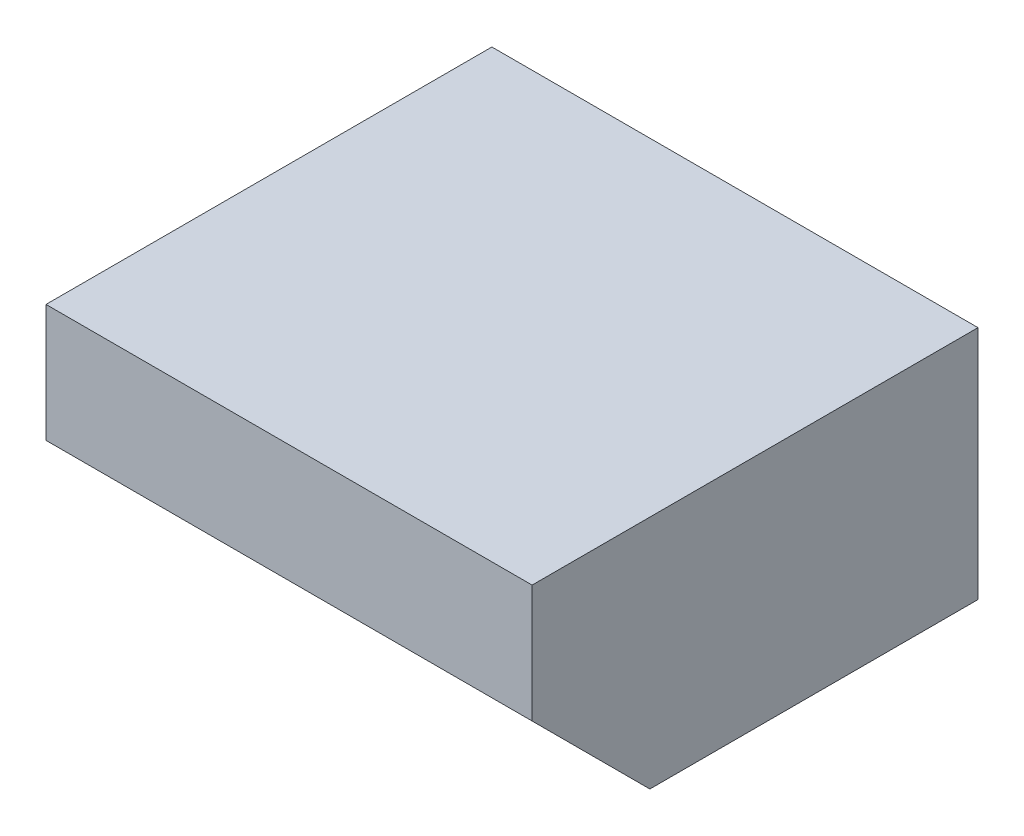
ISO-10303-21;
HEADER;
FILE_DESCRIPTION(('STEP AP214'),'2;1');
FILE_NAME('part.step','',(''),(''),'','','');
FILE_SCHEMA(('AUTOMOTIVE_DESIGN { 1 0 10303 214 1 1 1 1 }'));
ENDSEC;
DATA;
#1=APPLICATION_CONTEXT('core data for automotive mechanical design processes');
#2=APPLICATION_PROTOCOL_DEFINITION('international standard','automotive_design',2000,#1);
#3=PRODUCT_CONTEXT('',#1,'mechanical');
#4=PRODUCT('Part','Part','',(#3));
#5=PRODUCT_RELATED_PRODUCT_CATEGORY('part','',(#4));
#6=PRODUCT_DEFINITION_FORMATION('','',#4);
#7=PRODUCT_DEFINITION_CONTEXT('part definition',#1,'design');
#8=PRODUCT_DEFINITION('design','',#6,#7);
#9=PRODUCT_DEFINITION_SHAPE('','',#8);
#10=(LENGTH_UNIT() NAMED_UNIT(*) SI_UNIT(.MILLI.,.METRE.));
#11=(NAMED_UNIT(*) PLANE_ANGLE_UNIT() SI_UNIT($,.RADIAN.));
#12=(NAMED_UNIT(*) SI_UNIT($,.STERADIAN.) SOLID_ANGLE_UNIT());
#13=UNCERTAINTY_MEASURE_WITH_UNIT(LENGTH_MEASURE(1.E-05),#10,'distance_accuracy_value','');
#14=(GEOMETRIC_REPRESENTATION_CONTEXT(3) GLOBAL_UNCERTAINTY_ASSIGNED_CONTEXT((#13)) GLOBAL_UNIT_ASSIGNED_CONTEXT((#10,
#11,#12)) REPRESENTATION_CONTEXT('',''));
#15=CARTESIAN_POINT('',(0.,0.,0.));
#16=DIRECTION('',(0.,0.,1.));
#17=DIRECTION('',(1.,0.,0.));
#18=AXIS2_PLACEMENT_3D('',#15,#16,#17);
#19=CARTESIAN_POINT('',(9.97,0.,0.));
#20=DIRECTION('',(1.,0.,0.));
#21=DIRECTION('',(0.,1.,0.));
#22=AXIS2_PLACEMENT_3D('',#19,#20,#21);
#23=PLANE('',#22);
#24=DIRECTION('',(0.,0.,1.));
#25=VECTOR('',#24,1.);
#26=CARTESIAN_POINT('',(9.97,0.,0.));
#27=LINE('',#26,#25);
#28=CARTESIAN_POINT('',(9.97,0.,0.));
#29=VERTEX_POINT('',#28);
#30=CARTESIAN_POINT('',(9.97,0.,6.73));
#31=VERTEX_POINT('',#30);
#32=EDGE_CURVE('E98',#29,#31,#27,.T.);
#33=ORIENTED_EDGE('',*,*,#32,.F.);
#34=DIRECTION('',(0.,1.,0.));
#35=VECTOR('',#34,1.);
#36=CARTESIAN_POINT('',(9.97,0.,0.));
#37=LINE('',#36,#35);
#38=CARTESIAN_POINT('',(9.97,4.83,0.));
#39=VERTEX_POINT('',#38);
#40=EDGE_CURVE('E88',#29,#39,#37,.T.);
#41=ORIENTED_EDGE('',*,*,#40,.T.);
#42=DIRECTION('',(0.,0.,1.));
#43=VECTOR('',#42,1.);
#44=CARTESIAN_POINT('',(9.97,4.83,0.));
#45=LINE('',#44,#43);
#46=CARTESIAN_POINT('',(9.97,4.83,9.145));
#47=VERTEX_POINT('',#46);
#48=EDGE_CURVE('E11',#39,#47,#45,.T.);
#49=ORIENTED_EDGE('',*,*,#48,.T.);
#50=DIRECTION('',(0.,1.,0.));
#51=VECTOR('',#50,1.);
#52=CARTESIAN_POINT('',(9.97,0.,9.145));
#53=LINE('',#52,#51);
#54=CARTESIAN_POINT('',(9.97,2.415,9.145));
#55=VERTEX_POINT('',#54);
#56=EDGE_CURVE('E95',#55,#47,#53,.T.);
#57=ORIENTED_EDGE('',*,*,#56,.F.);
#58=DIRECTION('',(0.,0.707106781186548,0.707106781186548));
#59=VECTOR('',#58,1.);
#60=CARTESIAN_POINT('',(9.97,-1.07875,5.65125));
#61=LINE('',#60,#59);
#62=EDGE_CURVE('E99',#31,#55,#61,.T.);
#63=ORIENTED_EDGE('',*,*,#62,.F.);
#64=EDGE_LOOP('',(#33,#41,#49,#57,#63));
#65=FACE_BOUND('',#64,.T.);
#66=ADVANCED_FACE('F16',(#65),#23,.T.);
#67=CARTESIAN_POINT('',(0.,4.83,0.));
#68=DIRECTION('',(0.,1.,0.));
#69=DIRECTION('',(1.,0.,0.));
#70=AXIS2_PLACEMENT_3D('',#67,#68,#69);
#71=PLANE('',#70);
#72=DIRECTION('',(1.,0.,0.));
#73=VECTOR('',#72,1.);
#74=CARTESIAN_POINT('',(0.,4.83,0.));
#75=LINE('',#74,#73);
#76=CARTESIAN_POINT('',(0.,4.83,0.));
#77=VERTEX_POINT('',#76);
#78=EDGE_CURVE('E19',#77,#39,#75,.T.);
#79=ORIENTED_EDGE('',*,*,#78,.F.);
#80=DIRECTION('',(0.,0.,1.));
#81=VECTOR('',#80,1.);
#82=CARTESIAN_POINT('',(0.,4.83,0.));
#83=LINE('',#82,#81);
#84=CARTESIAN_POINT('',(0.,4.83,9.145));
#85=VERTEX_POINT('',#84);
#86=EDGE_CURVE('E117',#77,#85,#83,.T.);
#87=ORIENTED_EDGE('',*,*,#86,.T.);
#88=DIRECTION('',(1.,0.,0.));
#89=VECTOR('',#88,1.);
#90=CARTESIAN_POINT('',(0.,4.83,9.145));
#91=LINE('',#90,#89);
#92=EDGE_CURVE('E25',#85,#47,#91,.T.);
#93=ORIENTED_EDGE('',*,*,#92,.T.);
#94=ORIENTED_EDGE('',*,*,#48,.F.);
#95=EDGE_LOOP('',(#79,#87,#93,#94));
#96=FACE_BOUND('',#95,.T.);
#97=ADVANCED_FACE('F151',(#96),#71,.T.);
#98=CARTESIAN_POINT('',(0.,0.,9.145));
#99=DIRECTION('',(0.,0.,1.));
#100=DIRECTION('',(1.,0.,0.));
#101=AXIS2_PLACEMENT_3D('',#98,#99,#100);
#102=PLANE('',#101);
#103=DIRECTION('',(0.,1.,0.));
#104=VECTOR('',#103,1.);
#105=CARTESIAN_POINT('',(0.,0.,9.145));
#106=LINE('',#105,#104);
#107=CARTESIAN_POINT('',(0.,2.415,9.145));
#108=VERTEX_POINT('',#107);
#109=EDGE_CURVE('E118',#108,#85,#106,.T.);
#110=ORIENTED_EDGE('',*,*,#109,.F.);
#111=DIRECTION('',(1.,0.,0.));
#112=VECTOR('',#111,1.);
#113=CARTESIAN_POINT('',(0.,2.415,9.145));
#114=LINE('',#113,#112);
#115=EDGE_CURVE('E67',#108,#55,#114,.T.);
#116=ORIENTED_EDGE('',*,*,#115,.T.);
#117=ORIENTED_EDGE('',*,*,#56,.T.);
#118=ORIENTED_EDGE('',*,*,#92,.F.);
#119=EDGE_LOOP('',(#110,#116,#117,#118));
#120=FACE_BOUND('',#119,.T.);
#121=ADVANCED_FACE('F146',(#120),#102,.T.);
#122=CARTESIAN_POINT('',(0.,0.,0.));
#123=DIRECTION('',(0.,0.,1.));
#124=DIRECTION('',(1.,0.,0.));
#125=AXIS2_PLACEMENT_3D('',#122,#123,#124);
#126=PLANE('',#125);
#127=ORIENTED_EDGE('',*,*,#78,.T.);
#128=ORIENTED_EDGE('',*,*,#40,.F.);
#129=DIRECTION('',(1.,0.,0.));
#130=VECTOR('',#129,1.);
#131=CARTESIAN_POINT('',(0.,0.,0.));
#132=LINE('',#131,#130);
#133=CARTESIAN_POINT('',(0.,0.,0.));
#134=VERTEX_POINT('',#133);
#135=EDGE_CURVE('E92',#134,#29,#132,.T.);
#136=ORIENTED_EDGE('',*,*,#135,.F.);
#137=DIRECTION('',(0.,1.,0.));
#138=VECTOR('',#137,1.);
#139=CARTESIAN_POINT('',(0.,0.,0.));
#140=LINE('',#139,#138);
#141=EDGE_CURVE('E115',#134,#77,#140,.T.);
#142=ORIENTED_EDGE('',*,*,#141,.T.);
#143=EDGE_LOOP('',(#127,#128,#136,#142));
#144=FACE_BOUND('',#143,.T.);
#145=ADVANCED_FACE('F90',(#144),#126,.F.);
#146=CARTESIAN_POINT('',(0.,1.2075,7.9375));
#147=DIRECTION('',(0.,0.707106781186548,-0.707106781186548));
#148=DIRECTION('',(-1.,0.,0.));
#149=AXIS2_PLACEMENT_3D('',#146,#147,#148);
#150=PLANE('',#149);
#151=DIRECTION('',(0.,0.707106781186548,0.707106781186548));
#152=VECTOR('',#151,1.);
#153=CARTESIAN_POINT('',(0.,-1.07875,5.65125));
#154=LINE('',#153,#152);
#155=CARTESIAN_POINT('',(0.,0.,6.73));
#156=VERTEX_POINT('',#155);
#157=EDGE_CURVE('E122',#156,#108,#154,.T.);
#158=ORIENTED_EDGE('',*,*,#157,.F.);
#159=DIRECTION('',(1.,0.,0.));
#160=VECTOR('',#159,1.);
#161=CARTESIAN_POINT('',(0.,0.,6.73));
#162=LINE('',#161,#160);
#163=EDGE_CURVE('E108',#156,#31,#162,.T.);
#164=ORIENTED_EDGE('',*,*,#163,.T.);
#165=ORIENTED_EDGE('',*,*,#62,.T.);
#166=ORIENTED_EDGE('',*,*,#115,.F.);
#167=EDGE_LOOP('',(#158,#164,#165,#166));
#168=FACE_BOUND('',#167,.T.);
#169=ADVANCED_FACE('F164',(#168),#150,.F.);
#170=CARTESIAN_POINT('',(0.,0.,0.));
#171=DIRECTION('',(0.,1.,0.));
#172=DIRECTION('',(1.,0.,0.));
#173=AXIS2_PLACEMENT_3D('',#170,#171,#172);
#174=PLANE('',#173);
#175=ORIENTED_EDGE('',*,*,#163,.F.);
#176=DIRECTION('',(0.,0.,1.));
#177=VECTOR('',#176,1.);
#178=CARTESIAN_POINT('',(0.,0.,0.));
#179=LINE('',#178,#177);
#180=EDGE_CURVE('E105',#134,#156,#179,.T.);
#181=ORIENTED_EDGE('',*,*,#180,.F.);
#182=ORIENTED_EDGE('',*,*,#135,.T.);
#183=ORIENTED_EDGE('',*,*,#32,.T.);
#184=EDGE_LOOP('',(#175,#181,#182,#183));
#185=FACE_BOUND('',#184,.T.);
#186=ADVANCED_FACE('F103',(#185),#174,.F.);
#187=CARTESIAN_POINT('',(0.,0.,0.));
#188=DIRECTION('',(1.,0.,0.));
#189=DIRECTION('',(0.,1.,0.));
#190=AXIS2_PLACEMENT_3D('',#187,#188,#189);
#191=PLANE('',#190);
#192=ORIENTED_EDGE('',*,*,#157,.T.);
#193=ORIENTED_EDGE('',*,*,#109,.T.);
#194=ORIENTED_EDGE('',*,*,#86,.F.);
#195=ORIENTED_EDGE('',*,*,#141,.F.);
#196=ORIENTED_EDGE('',*,*,#180,.T.);
#197=EDGE_LOOP('',(#192,#193,#194,#195,#196));
#198=FACE_BOUND('',#197,.T.);
#199=ADVANCED_FACE('F163',(#198),#191,.F.);
#200=CLOSED_SHELL('',(#66,#97,#121,#145,#169,#186,#199));
#201=MANIFOLD_SOLID_BREP('B1',#200);
#202=ADVANCED_BREP_SHAPE_REPRESENTATION('',(#18,#201),#14);
#203=SHAPE_DEFINITION_REPRESENTATION(#9,#202);
ENDSEC;
END-ISO-10303-21;
